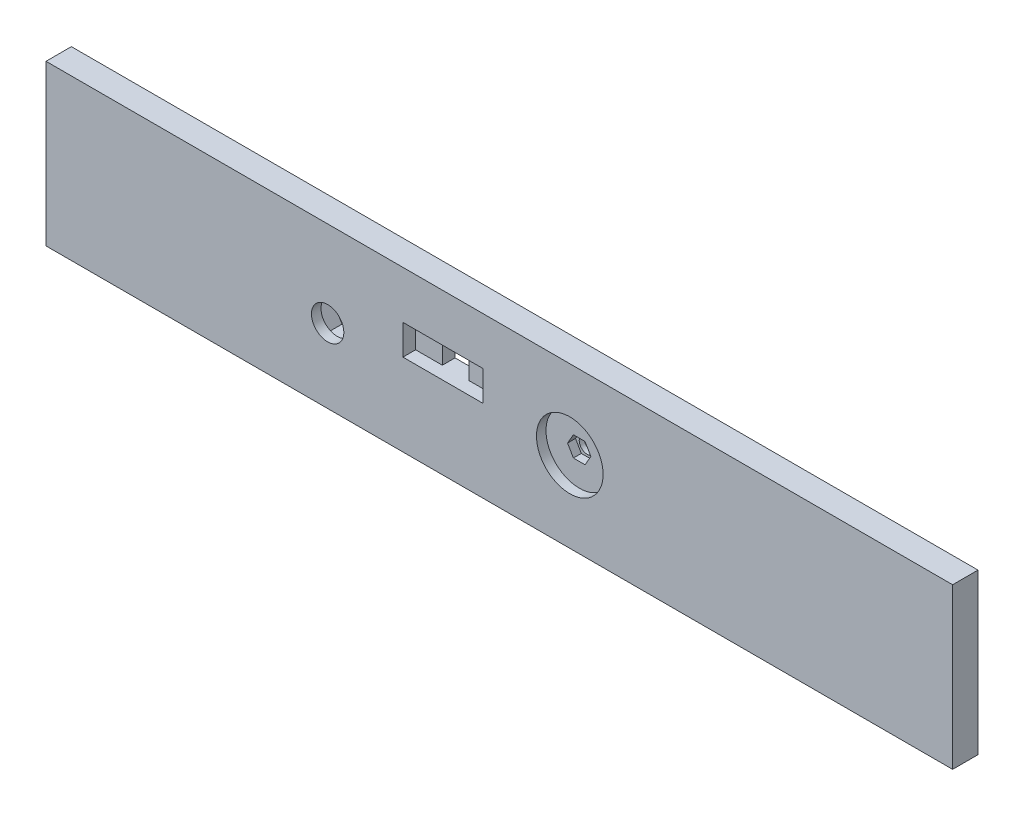
ISO-10303-21;
HEADER;
FILE_DESCRIPTION(('STEP AP214'),'2;1');
FILE_NAME('part.step','',(''),(''),'','','');
FILE_SCHEMA(('AUTOMOTIVE_DESIGN { 1 0 10303 214 1 1 1 1 }'));
ENDSEC;
DATA;
#1=APPLICATION_CONTEXT('core data for automotive mechanical design processes');
#2=APPLICATION_PROTOCOL_DEFINITION('international standard','automotive_design',2000,#1);
#3=PRODUCT_CONTEXT('',#1,'mechanical');
#4=PRODUCT('Part','Part','',(#3));
#5=PRODUCT_RELATED_PRODUCT_CATEGORY('part','',(#4));
#6=PRODUCT_DEFINITION_FORMATION('','',#4);
#7=PRODUCT_DEFINITION_CONTEXT('part definition',#1,'design');
#8=PRODUCT_DEFINITION('design','',#6,#7);
#9=PRODUCT_DEFINITION_SHAPE('','',#8);
#10=(LENGTH_UNIT() NAMED_UNIT(*) SI_UNIT(.MILLI.,.METRE.));
#11=(NAMED_UNIT(*) PLANE_ANGLE_UNIT() SI_UNIT($,.RADIAN.));
#12=(NAMED_UNIT(*) SI_UNIT($,.STERADIAN.) SOLID_ANGLE_UNIT());
#13=UNCERTAINTY_MEASURE_WITH_UNIT(LENGTH_MEASURE(1.E-05),#10,'distance_accuracy_value','');
#14=(GEOMETRIC_REPRESENTATION_CONTEXT(3) GLOBAL_UNCERTAINTY_ASSIGNED_CONTEXT((#13)) GLOBAL_UNIT_ASSIGNED_CONTEXT((#10,
#11,#12)) REPRESENTATION_CONTEXT('',''));
#15=CARTESIAN_POINT('',(0.,0.,0.));
#16=DIRECTION('',(0.,0.,1.));
#17=DIRECTION('',(1.,0.,0.));
#18=AXIS2_PLACEMENT_3D('',#15,#16,#17);
#19=CARTESIAN_POINT('',(258.55,70.8,8.));
#20=DIRECTION('',(1.,0.,0.));
#21=DIRECTION('',(0.,0.,-1.));
#22=AXIS2_PLACEMENT_3D('',#19,#20,#21);
#23=PLANE('',#22);
#24=DIRECTION('',(0.,-1.,0.));
#25=VECTOR('',#24,1.);
#26=CARTESIAN_POINT('',(258.55,70.8,0.));
#27=LINE('',#26,#25);
#28=CARTESIAN_POINT('',(258.55,70.8,0.));
#29=VERTEX_POINT('',#28);
#30=CARTESIAN_POINT('',(258.55,51.8,0.));
#31=VERTEX_POINT('',#30);
#32=EDGE_CURVE('E263',#29,#31,#27,.T.);
#33=ORIENTED_EDGE('',*,*,#32,.F.);
#34=DIRECTION('',(0.,0.,-1.));
#35=VECTOR('',#34,1.);
#36=CARTESIAN_POINT('',(258.55,70.8,8.));
#37=LINE('',#36,#35);
#38=CARTESIAN_POINT('',(258.55,70.8,-8.));
#39=VERTEX_POINT('',#38);
#40=EDGE_CURVE('E273',#29,#39,#37,.T.);
#41=ORIENTED_EDGE('',*,*,#40,.T.);
#42=DIRECTION('',(0.,-1.,0.));
#43=VECTOR('',#42,1.);
#44=CARTESIAN_POINT('',(258.55,0.,-8.));
#45=LINE('',#44,#43);
#46=CARTESIAN_POINT('',(258.55,51.8,-8.));
#47=VERTEX_POINT('',#46);
#48=EDGE_CURVE('E11',#39,#47,#45,.T.);
#49=ORIENTED_EDGE('',*,*,#48,.T.);
#50=DIRECTION('',(0.,0.,-1.));
#51=VECTOR('',#50,1.);
#52=CARTESIAN_POINT('',(258.55,51.8,8.));
#53=LINE('',#52,#51);
#54=EDGE_CURVE('E272',#31,#47,#53,.T.);
#55=ORIENTED_EDGE('',*,*,#54,.F.);
#56=EDGE_LOOP('',(#33,#41,#49,#55));
#57=FACE_BOUND('',#56,.T.);
#58=ADVANCED_FACE('F45',(#57),#23,.F.);
#59=CARTESIAN_POINT('',(241.85,70.8,8.));
#60=DIRECTION('',(-1.,0.,0.));
#61=DIRECTION('',(0.,0.,1.));
#62=AXIS2_PLACEMENT_3D('',#59,#60,#61);
#63=PLANE('',#62);
#64=DIRECTION('',(0.,1.,0.));
#65=VECTOR('',#64,1.);
#66=CARTESIAN_POINT('',(241.85,70.8,0.));
#67=LINE('',#66,#65);
#68=CARTESIAN_POINT('',(241.85,51.8,0.));
#69=VERTEX_POINT('',#68);
#70=CARTESIAN_POINT('',(241.85,70.8,0.));
#71=VERTEX_POINT('',#70);
#72=EDGE_CURVE('E253',#69,#71,#67,.T.);
#73=ORIENTED_EDGE('',*,*,#72,.F.);
#74=DIRECTION('',(0.,0.,-1.));
#75=VECTOR('',#74,1.);
#76=CARTESIAN_POINT('',(241.85,51.8,8.));
#77=LINE('',#76,#75);
#78=CARTESIAN_POINT('',(241.85,51.8,-8.));
#79=VERTEX_POINT('',#78);
#80=EDGE_CURVE('E223',#69,#79,#77,.T.);
#81=ORIENTED_EDGE('',*,*,#80,.T.);
#82=DIRECTION('',(0.,1.,0.));
#83=VECTOR('',#82,1.);
#84=CARTESIAN_POINT('',(241.85,0.,-8.));
#85=LINE('',#84,#83);
#86=CARTESIAN_POINT('',(241.85,70.8,-8.));
#87=VERTEX_POINT('',#86);
#88=EDGE_CURVE('E484',#79,#87,#85,.T.);
#89=ORIENTED_EDGE('',*,*,#88,.T.);
#90=DIRECTION('',(0.,0.,-1.));
#91=VECTOR('',#90,1.);
#92=CARTESIAN_POINT('',(241.85,70.8,8.));
#93=LINE('',#92,#91);
#94=EDGE_CURVE('E277',#71,#87,#93,.T.);
#95=ORIENTED_EDGE('',*,*,#94,.F.);
#96=EDGE_LOOP('',(#73,#81,#89,#95));
#97=FACE_BOUND('',#96,.T.);
#98=ADVANCED_FACE('F550',(#97),#63,.F.);
#99=CARTESIAN_POINT('',(177.536724471013,46.6000393211323,-8.));
#100=DIRECTION('',(0.,0.,1.));
#101=DIRECTION('',(1.,0.,0.));
#102=AXIS2_PLACEMENT_3D('',#99,#100,#101);
#103=CYLINDRICAL_SURFACE('',#102,10.2);
#104=CARTESIAN_POINT('',(177.536724471013,46.6000393211323,8.));
#105=DIRECTION('',(0.,0.,1.));
#106=DIRECTION('',(1.,0.,0.));
#107=AXIS2_PLACEMENT_3D('',#104,#105,#106);
#108=CIRCLE('',#107,10.2);
#109=CARTESIAN_POINT('',(187.736724471013,46.6000393211323,8.));
#110=VERTEX_POINT('',#109);
#111=EDGE_CURVE('E373',#110,#110,#108,.T.);
#112=ORIENTED_EDGE('',*,*,#111,.T.);
#113=EDGE_LOOP('',(#112));
#114=FACE_BOUND('',#113,.T.);
#115=CARTESIAN_POINT('',(177.536724471013,46.6000393211323,2.));
#116=DIRECTION('',(0.,0.,-1.));
#117=DIRECTION('',(-1.,0.,0.));
#118=AXIS2_PLACEMENT_3D('',#115,#116,#117);
#119=CIRCLE('',#118,10.2);
#120=CARTESIAN_POINT('',(167.336724471013,46.6000393211323,2.));
#121=VERTEX_POINT('',#120);
#122=EDGE_CURVE('E334',#121,#121,#119,.F.);
#123=ORIENTED_EDGE('',*,*,#122,.F.);
#124=EDGE_LOOP('',(#123));
#125=FACE_BOUND('',#124,.T.);
#126=ADVANCED_FACE('F556',(#114,#125),#103,.F.);
#127=CARTESIAN_POINT('',(333.795565484393,44.44,-3.));
#128=DIRECTION('',(0.866025403784437,-0.500000000000003,0.));
#129=DIRECTION('',(0.500000000000003,0.866025403784437,0.));
#130=AXIS2_PLACEMENT_3D('',#127,#128,#129);
#131=PLANE('',#130);
#132=DIRECTION('',(-0.500000000000003,-0.866025403784437,0.));
#133=VECTOR('',#132,1.);
#134=CARTESIAN_POINT('',(333.795565484393,44.44,2.));
#135=LINE('',#134,#133);
#136=CARTESIAN_POINT('',(337.467513196439,50.7999999999999,2.));
#137=VERTEX_POINT('',#136);
#138=CARTESIAN_POINT('',(333.795565484393,44.44,2.));
#139=VERTEX_POINT('',#138);
#140=EDGE_CURVE('E370',#137,#139,#135,.T.);
#141=ORIENTED_EDGE('',*,*,#140,.F.);
#142=DIRECTION('',(0.,0.,1.));
#143=VECTOR('',#142,1.);
#144=CARTESIAN_POINT('',(337.467513196439,50.7999999999999,-3.));
#145=LINE('',#144,#143);
#146=CARTESIAN_POINT('',(337.467513196439,50.7999999999999,-3.));
#147=VERTEX_POINT('',#146);
#148=EDGE_CURVE('E401',#147,#137,#145,.T.);
#149=ORIENTED_EDGE('',*,*,#148,.F.);
#150=DIRECTION('',(0.500000000000003,0.866025403784437,0.));
#151=VECTOR('',#150,1.);
#152=CARTESIAN_POINT('',(333.795565484393,44.44,-3.));
#153=LINE('',#152,#151);
#154=CARTESIAN_POINT('',(333.795565484393,44.44,-3.));
#155=VERTEX_POINT('',#154);
#156=EDGE_CURVE('E377',#155,#147,#153,.T.);
#157=ORIENTED_EDGE('',*,*,#156,.F.);
#158=DIRECTION('',(0.,0.,1.));
#159=VECTOR('',#158,1.);
#160=CARTESIAN_POINT('',(333.795565484393,44.44,-3.));
#161=LINE('',#160,#159);
#162=EDGE_CURVE('E402',#155,#139,#161,.T.);
#163=ORIENTED_EDGE('',*,*,#162,.T.);
#164=EDGE_LOOP('',(#141,#149,#157,#163));
#165=FACE_BOUND('',#164,.T.);
#166=ADVANCED_FACE('F598',(#165),#131,.F.);
#167=CARTESIAN_POINT('',(326.451670060301,44.44,-3.));
#168=DIRECTION('',(0.,-1.,0.));
#169=DIRECTION('',(0.,0.,-1.));
#170=AXIS2_PLACEMENT_3D('',#167,#168,#169);
#171=PLANE('',#170);
#172=DIRECTION('',(-1.,0.,0.));
#173=VECTOR('',#172,1.);
#174=CARTESIAN_POINT('',(326.451670060301,44.44,2.));
#175=LINE('',#174,#173);
#176=CARTESIAN_POINT('',(326.451670060301,44.44,2.));
#177=VERTEX_POINT('',#176);
#178=EDGE_CURVE('E367',#139,#177,#175,.T.);
#179=ORIENTED_EDGE('',*,*,#178,.F.);
#180=ORIENTED_EDGE('',*,*,#162,.F.);
#181=DIRECTION('',(1.,0.,0.));
#182=VECTOR('',#181,1.);
#183=CARTESIAN_POINT('',(326.451670060301,44.44,-3.));
#184=LINE('',#183,#182);
#185=CARTESIAN_POINT('',(326.451670060301,44.44,-3.));
#186=VERTEX_POINT('',#185);
#187=EDGE_CURVE('E397',#186,#155,#184,.T.);
#188=ORIENTED_EDGE('',*,*,#187,.F.);
#189=DIRECTION('',(0.,0.,1.));
#190=VECTOR('',#189,1.);
#191=CARTESIAN_POINT('',(326.451670060301,44.44,-3.));
#192=LINE('',#191,#190);
#193=EDGE_CURVE('E407',#186,#177,#192,.T.);
#194=ORIENTED_EDGE('',*,*,#193,.T.);
#195=EDGE_LOOP('',(#179,#180,#188,#194));
#196=FACE_BOUND('',#195,.T.);
#197=ADVANCED_FACE('F603',(#196),#171,.F.);
#198=CARTESIAN_POINT('',(322.779722348255,50.7999999999999,-3.));
#199=DIRECTION('',(-0.86602540378444,-0.499999999999998,0.));
#200=DIRECTION('',(0.499999999999998,-0.86602540378444,0.));
#201=AXIS2_PLACEMENT_3D('',#198,#199,#200);
#202=PLANE('',#201);
#203=DIRECTION('',(-0.499999999999998,0.86602540378444,0.));
#204=VECTOR('',#203,1.);
#205=CARTESIAN_POINT('',(322.779722348255,50.7999999999999,2.));
#206=LINE('',#205,#204);
#207=CARTESIAN_POINT('',(322.779722348255,50.7999999999999,2.));
#208=VERTEX_POINT('',#207);
#209=EDGE_CURVE('E364',#177,#208,#206,.T.);
#210=ORIENTED_EDGE('',*,*,#209,.F.);
#211=ORIENTED_EDGE('',*,*,#193,.F.);
#212=DIRECTION('',(0.499999999999998,-0.86602540378444,0.));
#213=VECTOR('',#212,1.);
#214=CARTESIAN_POINT('',(322.779722348255,50.7999999999999,-3.));
#215=LINE('',#214,#213);
#216=CARTESIAN_POINT('',(322.779722348255,50.7999999999999,-3.));
#217=VERTEX_POINT('',#216);
#218=EDGE_CURVE('E393',#217,#186,#215,.T.);
#219=ORIENTED_EDGE('',*,*,#218,.F.);
#220=DIRECTION('',(0.,0.,1.));
#221=VECTOR('',#220,1.);
#222=CARTESIAN_POINT('',(322.779722348255,50.7999999999999,-3.));
#223=LINE('',#222,#221);
#224=EDGE_CURVE('E411',#217,#208,#223,.T.);
#225=ORIENTED_EDGE('',*,*,#224,.T.);
#226=EDGE_LOOP('',(#210,#211,#219,#225));
#227=FACE_BOUND('',#226,.T.);
#228=ADVANCED_FACE('F606',(#227),#202,.F.);
#229=CARTESIAN_POINT('',(326.451670060301,57.1599999999999,-3.));
#230=DIRECTION('',(-0.866025403784441,0.499999999999996,0.));
#231=DIRECTION('',(-0.499999999999996,-0.866025403784441,0.));
#232=AXIS2_PLACEMENT_3D('',#229,#230,#231);
#233=PLANE('',#232);
#234=DIRECTION('',(0.499999999999996,0.866025403784441,0.));
#235=VECTOR('',#234,1.);
#236=CARTESIAN_POINT('',(326.451670060301,57.1599999999999,2.));
#237=LINE('',#236,#235);
#238=CARTESIAN_POINT('',(326.451670060301,57.1599999999999,2.));
#239=VERTEX_POINT('',#238);
#240=EDGE_CURVE('E361',#208,#239,#237,.T.);
#241=ORIENTED_EDGE('',*,*,#240,.F.);
#242=ORIENTED_EDGE('',*,*,#224,.F.);
#243=DIRECTION('',(-0.499999999999996,-0.866025403784441,0.));
#244=VECTOR('',#243,1.);
#245=CARTESIAN_POINT('',(326.451670060301,57.1599999999999,-3.));
#246=LINE('',#245,#244);
#247=CARTESIAN_POINT('',(326.451670060301,57.1599999999999,-3.));
#248=VERTEX_POINT('',#247);
#249=EDGE_CURVE('E389',#248,#217,#246,.T.);
#250=ORIENTED_EDGE('',*,*,#249,.F.);
#251=DIRECTION('',(0.,0.,1.));
#252=VECTOR('',#251,1.);
#253=CARTESIAN_POINT('',(326.451670060301,57.1599999999999,-3.));
#254=LINE('',#253,#252);
#255=EDGE_CURVE('E415',#248,#239,#254,.T.);
#256=ORIENTED_EDGE('',*,*,#255,.T.);
#257=EDGE_LOOP('',(#241,#242,#250,#256));
#258=FACE_BOUND('',#257,.T.);
#259=ADVANCED_FACE('F610',(#258),#233,.F.);
#260=CARTESIAN_POINT('',(333.795565484393,57.1599999999999,-3.));
#261=DIRECTION('',(0.,1.,0.));
#262=DIRECTION('',(0.,0.,1.));
#263=AXIS2_PLACEMENT_3D('',#260,#261,#262);
#264=PLANE('',#263);
#265=DIRECTION('',(1.,0.,0.));
#266=VECTOR('',#265,1.);
#267=CARTESIAN_POINT('',(333.795565484393,57.1599999999999,2.));
#268=LINE('',#267,#266);
#269=CARTESIAN_POINT('',(333.795565484393,57.1599999999999,2.));
#270=VERTEX_POINT('',#269);
#271=EDGE_CURVE('E354',#239,#270,#268,.T.);
#272=ORIENTED_EDGE('',*,*,#271,.F.);
#273=ORIENTED_EDGE('',*,*,#255,.F.);
#274=DIRECTION('',(-1.,0.,0.));
#275=VECTOR('',#274,1.);
#276=CARTESIAN_POINT('',(333.795565484393,57.1599999999999,-3.));
#277=LINE('',#276,#275);
#278=CARTESIAN_POINT('',(333.795565484393,57.1599999999999,-3.));
#279=VERTEX_POINT('',#278);
#280=EDGE_CURVE('E385',#279,#248,#277,.T.);
#281=ORIENTED_EDGE('',*,*,#280,.F.);
#282=DIRECTION('',(0.,0.,1.));
#283=VECTOR('',#282,1.);
#284=CARTESIAN_POINT('',(333.795565484393,57.1599999999999,-3.));
#285=LINE('',#284,#283);
#286=EDGE_CURVE('E419',#279,#270,#285,.T.);
#287=ORIENTED_EDGE('',*,*,#286,.T.);
#288=EDGE_LOOP('',(#272,#273,#281,#287));
#289=FACE_BOUND('',#288,.T.);
#290=ADVANCED_FACE('F614',(#289),#264,.F.);
#291=CARTESIAN_POINT('',(337.467513196439,50.7999999999999,-3.));
#292=DIRECTION('',(0.866025403784438,0.500000000000002,0.));
#293=DIRECTION('',(-0.500000000000002,0.866025403784438,0.));
#294=AXIS2_PLACEMENT_3D('',#291,#292,#293);
#295=PLANE('',#294);
#296=DIRECTION('',(0.500000000000002,-0.866025403784438,0.));
#297=VECTOR('',#296,1.);
#298=CARTESIAN_POINT('',(337.467513196439,50.7999999999999,2.));
#299=LINE('',#298,#297);
#300=EDGE_CURVE('E472',#270,#137,#299,.T.);
#301=ORIENTED_EDGE('',*,*,#300,.F.);
#302=ORIENTED_EDGE('',*,*,#286,.F.);
#303=DIRECTION('',(-0.500000000000002,0.866025403784437,0.));
#304=VECTOR('',#303,1.);
#305=CARTESIAN_POINT('',(337.467513196439,50.7999999999999,-3.));
#306=LINE('',#305,#304);
#307=EDGE_CURVE('E381',#147,#279,#306,.T.);
#308=ORIENTED_EDGE('',*,*,#307,.F.);
#309=ORIENTED_EDGE('',*,*,#148,.T.);
#310=EDGE_LOOP('',(#301,#302,#308,#309));
#311=FACE_BOUND('',#310,.T.);
#312=ADVANCED_FACE('F618',(#311),#295,.F.);
#313=CARTESIAN_POINT('',(330.123617772347,50.8,8.));
#314=DIRECTION('',(0.,0.,-1.));
#315=DIRECTION('',(-1.,0.,0.));
#316=AXIS2_PLACEMENT_3D('',#313,#314,#315);
#317=CYLINDRICAL_SURFACE('',#316,4.99999999999999);
#318=CARTESIAN_POINT('',(330.123617772347,50.8,-6.));
#319=DIRECTION('',(0.,0.,-1.));
#320=DIRECTION('',(-1.,0.,0.));
#321=AXIS2_PLACEMENT_3D('',#318,#319,#320);
#322=CIRCLE('',#321,4.99999999999999);
#323=CARTESIAN_POINT('',(325.123617772347,50.8,-6.));
#324=VERTEX_POINT('',#323);
#325=EDGE_CURVE('E426',#324,#324,#322,.T.);
#326=ORIENTED_EDGE('',*,*,#325,.T.);
#327=EDGE_LOOP('',(#326));
#328=FACE_BOUND('',#327,.T.);
#329=CARTESIAN_POINT('',(330.123617772347,50.8,-3.));
#330=DIRECTION('',(0.,0.,1.));
#331=DIRECTION('',(1.,0.,0.));
#332=AXIS2_PLACEMENT_3D('',#329,#330,#331);
#333=CIRCLE('',#332,4.99999999999999);
#334=CARTESIAN_POINT('',(335.123617772347,50.8,-3.));
#335=VERTEX_POINT('',#334);
#336=EDGE_CURVE('E406',#335,#335,#333,.F.);
#337=ORIENTED_EDGE('',*,*,#336,.F.);
#338=EDGE_LOOP('',(#337));
#339=FACE_BOUND('',#338,.T.);
#340=ADVANCED_FACE('F622',(#328,#339),#317,.F.);
#341=CARTESIAN_POINT('',(0.,0.,8.));
#342=DIRECTION('',(1.,0.,0.));
#343=DIRECTION('',(0.,0.,-1.));
#344=AXIS2_PLACEMENT_3D('',#341,#342,#343);
#345=PLANE('',#344);
#346=DIRECTION('',(0.,-1.,0.));
#347=VECTOR('',#346,1.);
#348=CARTESIAN_POINT('',(0.,0.,-8.));
#349=LINE('',#348,#347);
#350=CARTESIAN_POINT('',(0.,100.8,-8.));
#351=VERTEX_POINT('',#350);
#352=CARTESIAN_POINT('',(0.,0.,-8.));
#353=VERTEX_POINT('',#352);
#354=EDGE_CURVE('E430',#351,#353,#349,.T.);
#355=ORIENTED_EDGE('',*,*,#354,.T.);
#356=DIRECTION('',(0.,0.,-1.));
#357=VECTOR('',#356,1.);
#358=CARTESIAN_POINT('',(0.,0.,8.));
#359=LINE('',#358,#357);
#360=CARTESIAN_POINT('',(0.,0.,8.));
#361=VERTEX_POINT('',#360);
#362=EDGE_CURVE('E468',#361,#353,#359,.T.);
#363=ORIENTED_EDGE('',*,*,#362,.F.);
#364=DIRECTION('',(0.,-1.,0.));
#365=VECTOR('',#364,1.);
#366=CARTESIAN_POINT('',(0.,0.,8.));
#367=LINE('',#366,#365);
#368=CARTESIAN_POINT('',(0.,100.8,8.));
#369=VERTEX_POINT('',#368);
#370=EDGE_CURVE('E431',#369,#361,#367,.T.);
#371=ORIENTED_EDGE('',*,*,#370,.F.);
#372=DIRECTION('',(0.,0.,-1.));
#373=VECTOR('',#372,1.);
#374=CARTESIAN_POINT('',(0.,100.8,8.));
#375=LINE('',#374,#373);
#376=EDGE_CURVE('E445',#369,#351,#375,.T.);
#377=ORIENTED_EDGE('',*,*,#376,.T.);
#378=EDGE_LOOP('',(#355,#363,#371,#377));
#379=FACE_BOUND('',#378,.T.);
#380=ADVANCED_FACE('F47',(#379),#345,.F.);
#381=CARTESIAN_POINT('',(0.,0.,8.));
#382=DIRECTION('',(0.,1.,0.));
#383=DIRECTION('',(0.,0.,1.));
#384=AXIS2_PLACEMENT_3D('',#381,#382,#383);
#385=PLANE('',#384);
#386=DIRECTION('',(1.,0.,0.));
#387=VECTOR('',#386,1.);
#388=CARTESIAN_POINT('',(0.,0.,-8.));
#389=LINE('',#388,#387);
#390=CARTESIAN_POINT('',(571.5,0.,-8.));
#391=VERTEX_POINT('',#390);
#392=EDGE_CURVE('E449',#353,#391,#389,.T.);
#393=ORIENTED_EDGE('',*,*,#392,.T.);
#394=DIRECTION('',(0.,0.,-1.));
#395=VECTOR('',#394,1.);
#396=CARTESIAN_POINT('',(571.5,0.,8.));
#397=LINE('',#396,#395);
#398=CARTESIAN_POINT('',(571.5,0.,8.));
#399=VERTEX_POINT('',#398);
#400=EDGE_CURVE('E464',#399,#391,#397,.T.);
#401=ORIENTED_EDGE('',*,*,#400,.F.);
#402=DIRECTION('',(1.,0.,0.));
#403=VECTOR('',#402,1.);
#404=CARTESIAN_POINT('',(0.,0.,8.));
#405=LINE('',#404,#403);
#406=EDGE_CURVE('E435',#361,#399,#405,.T.);
#407=ORIENTED_EDGE('',*,*,#406,.F.);
#408=ORIENTED_EDGE('',*,*,#362,.T.);
#409=EDGE_LOOP('',(#393,#401,#407,#408));
#410=FACE_BOUND('',#409,.T.);
#411=ADVANCED_FACE('F527',(#410),#385,.F.);
#412=CARTESIAN_POINT('',(571.5,0.,8.));
#413=DIRECTION('',(-1.,0.,0.));
#414=DIRECTION('',(0.,0.,1.));
#415=AXIS2_PLACEMENT_3D('',#412,#413,#414);
#416=PLANE('',#415);
#417=DIRECTION('',(0.,1.,0.));
#418=VECTOR('',#417,1.);
#419=CARTESIAN_POINT('',(571.5,0.,-8.));
#420=LINE('',#419,#418);
#421=CARTESIAN_POINT('',(571.5,100.8,-8.));
#422=VERTEX_POINT('',#421);
#423=EDGE_CURVE('E452',#391,#422,#420,.T.);
#424=ORIENTED_EDGE('',*,*,#423,.T.);
#425=DIRECTION('',(0.,0.,-1.));
#426=VECTOR('',#425,1.);
#427=CARTESIAN_POINT('',(571.5,100.8,8.));
#428=LINE('',#427,#426);
#429=CARTESIAN_POINT('',(571.5,100.8,8.));
#430=VERTEX_POINT('',#429);
#431=EDGE_CURVE('E460',#430,#422,#428,.T.);
#432=ORIENTED_EDGE('',*,*,#431,.F.);
#433=DIRECTION('',(0.,1.,0.));
#434=VECTOR('',#433,1.);
#435=CARTESIAN_POINT('',(571.5,0.,8.));
#436=LINE('',#435,#434);
#437=EDGE_CURVE('E439',#399,#430,#436,.T.);
#438=ORIENTED_EDGE('',*,*,#437,.F.);
#439=ORIENTED_EDGE('',*,*,#400,.T.);
#440=EDGE_LOOP('',(#424,#432,#438,#439));
#441=FACE_BOUND('',#440,.T.);
#442=ADVANCED_FACE('F532',(#441),#416,.F.);
#443=CARTESIAN_POINT('',(0.,100.8,8.));
#444=DIRECTION('',(0.,-1.,0.));
#445=DIRECTION('',(0.,0.,-1.));
#446=AXIS2_PLACEMENT_3D('',#443,#444,#445);
#447=PLANE('',#446);
#448=DIRECTION('',(-1.,0.,0.));
#449=VECTOR('',#448,1.);
#450=CARTESIAN_POINT('',(0.,100.8,-8.));
#451=LINE('',#450,#449);
#452=EDGE_CURVE('E436',#422,#351,#451,.T.);
#453=ORIENTED_EDGE('',*,*,#452,.T.);
#454=ORIENTED_EDGE('',*,*,#376,.F.);
#455=DIRECTION('',(-1.,0.,0.));
#456=VECTOR('',#455,1.);
#457=CARTESIAN_POINT('',(0.,100.8,8.));
#458=LINE('',#457,#456);
#459=EDGE_CURVE('E442',#430,#369,#458,.T.);
#460=ORIENTED_EDGE('',*,*,#459,.F.);
#461=ORIENTED_EDGE('',*,*,#431,.T.);
#462=EDGE_LOOP('',(#453,#454,#460,#461));
#463=FACE_BOUND('',#462,.T.);
#464=ADVANCED_FACE('F513',(#463),#447,.F.);
#465=CARTESIAN_POINT('',(0.,0.,8.));
#466=DIRECTION('',(0.,0.,-1.));
#467=DIRECTION('',(-1.,0.,0.));
#468=AXIS2_PLACEMENT_3D('',#465,#466,#467);
#469=PLANE('',#468);
#470=DIRECTION('',(1.,0.,0.));
#471=VECTOR('',#470,1.);
#472=CARTESIAN_POINT('',(258.55,70.8,8.));
#473=LINE('',#472,#471);
#474=CARTESIAN_POINT('',(225.,70.8,8.));
#475=VERTEX_POINT('',#474);
#476=CARTESIAN_POINT('',(275.4,70.8,8.));
#477=VERTEX_POINT('',#476);
#478=EDGE_CURVE('E269',#475,#477,#473,.T.);
#479=ORIENTED_EDGE('',*,*,#478,.T.);
#480=DIRECTION('',(0.,1.,0.));
#481=VECTOR('',#480,1.);
#482=CARTESIAN_POINT('',(275.4,70.8,8.));
#483=LINE('',#482,#481);
#484=CARTESIAN_POINT('',(275.4,51.8,8.));
#485=VERTEX_POINT('',#484);
#486=EDGE_CURVE('E233',#485,#477,#483,.T.);
#487=ORIENTED_EDGE('',*,*,#486,.F.);
#488=DIRECTION('',(-1.,0.,0.));
#489=VECTOR('',#488,1.);
#490=CARTESIAN_POINT('',(258.55,51.8,8.));
#491=LINE('',#490,#489);
#492=CARTESIAN_POINT('',(225.,51.8,8.));
#493=VERTEX_POINT('',#492);
#494=EDGE_CURVE('E266',#485,#493,#491,.T.);
#495=ORIENTED_EDGE('',*,*,#494,.T.);
#496=DIRECTION('',(0.,-1.,0.));
#497=VECTOR('',#496,1.);
#498=CARTESIAN_POINT('',(225.,70.8,8.));
#499=LINE('',#498,#497);
#500=EDGE_CURVE('E215',#475,#493,#499,.T.);
#501=ORIENTED_EDGE('',*,*,#500,.F.);
#502=EDGE_LOOP('',(#479,#487,#495,#501));
#503=FACE_BOUND('',#502,.T.);
#504=CARTESIAN_POINT('',(330.163945869874,50.8218449205319,8.));
#505=DIRECTION('',(0.,0.,1.));
#506=DIRECTION('',(1.,0.,0.));
#507=AXIS2_PLACEMENT_3D('',#504,#505,#506);
#508=CIRCLE('',#507,21.);
#509=CARTESIAN_POINT('',(351.163945869874,50.8218449205319,8.));
#510=VERTEX_POINT('',#509);
#511=EDGE_CURVE('E355',#510,#510,#508,.T.);
#512=ORIENTED_EDGE('',*,*,#511,.F.);
#513=EDGE_LOOP('',(#512));
#514=FACE_BOUND('',#513,.T.);
#515=ORIENTED_EDGE('',*,*,#111,.F.);
#516=EDGE_LOOP('',(#515));
#517=FACE_BOUND('',#516,.T.);
#518=ORIENTED_EDGE('',*,*,#370,.T.);
#519=ORIENTED_EDGE('',*,*,#406,.T.);
#520=ORIENTED_EDGE('',*,*,#437,.T.);
#521=ORIENTED_EDGE('',*,*,#459,.T.);
#522=EDGE_LOOP('',(#518,#519,#520,#521));
#523=FACE_BOUND('',#522,.T.);
#524=ADVANCED_FACE('F510',(#503,#514,#517,#523),#469,.F.);
#525=CARTESIAN_POINT('',(0.,0.,-8.));
#526=DIRECTION('',(0.,0.,-1.));
#527=DIRECTION('',(-1.,0.,0.));
#528=AXIS2_PLACEMENT_3D('',#525,#526,#527);
#529=PLANE('',#528);
#530=CARTESIAN_POINT('',(330.163945869874,50.8218449205319,-8.));
#531=DIRECTION('',(0.,0.,-1.));
#532=DIRECTION('',(-1.,0.,0.));
#533=AXIS2_PLACEMENT_3D('',#530,#531,#532);
#534=CIRCLE('',#533,15.);
#535=CARTESIAN_POINT('',(315.163945869874,50.8218449205319,-8.));
#536=VERTEX_POINT('',#535);
#537=EDGE_CURVE('E240',#536,#536,#534,.T.);
#538=ORIENTED_EDGE('',*,*,#537,.F.);
#539=EDGE_LOOP('',(#538));
#540=FACE_BOUND('',#539,.T.);
#541=ORIENTED_EDGE('',*,*,#48,.F.);
#542=DIRECTION('',(1.,0.,0.));
#543=VECTOR('',#542,1.);
#544=CARTESIAN_POINT('',(0.,70.8,-8.));
#545=LINE('',#544,#543);
#546=EDGE_CURVE('E54',#87,#39,#545,.T.);
#547=ORIENTED_EDGE('',*,*,#546,.F.);
#548=ORIENTED_EDGE('',*,*,#88,.F.);
#549=DIRECTION('',(-1.,0.,0.));
#550=VECTOR('',#549,1.);
#551=CARTESIAN_POINT('',(0.,51.8,-8.));
#552=LINE('',#551,#550);
#553=EDGE_CURVE('E478',#47,#79,#552,.T.);
#554=ORIENTED_EDGE('',*,*,#553,.F.);
#555=EDGE_LOOP('',(#541,#547,#548,#554));
#556=FACE_BOUND('',#555,.T.);
#557=DIRECTION('',(-0.500000000000001,0.866025403784438,0.));
#558=VECTOR('',#557,1.);
#559=CARTESIAN_POINT('',(170.608521240738,34.6000393211323,-8.));
#560=LINE('',#559,#558);
#561=CARTESIAN_POINT('',(170.608521240738,34.6000393211323,-8.));
#562=VERTEX_POINT('',#561);
#563=CARTESIAN_POINT('',(163.680318010462,46.6000393211323,-8.));
#564=VERTEX_POINT('',#563);
#565=EDGE_CURVE('E276',#562,#564,#560,.T.);
#566=ORIENTED_EDGE('',*,*,#565,.F.);
#567=DIRECTION('',(-1.,0.,0.));
#568=VECTOR('',#567,1.);
#569=CARTESIAN_POINT('',(184.464927701289,34.6000393211323,-8.));
#570=LINE('',#569,#568);
#571=CARTESIAN_POINT('',(184.464927701289,34.6000393211323,-8.));
#572=VERTEX_POINT('',#571);
#573=EDGE_CURVE('E289',#572,#562,#570,.T.);
#574=ORIENTED_EDGE('',*,*,#573,.F.);
#575=DIRECTION('',(-0.499999999999999,-0.866025403784439,0.));
#576=VECTOR('',#575,1.);
#577=CARTESIAN_POINT('',(191.393130931564,46.6000393211323,-8.));
#578=LINE('',#577,#576);
#579=CARTESIAN_POINT('',(191.393130931564,46.6000393211323,-8.));
#580=VERTEX_POINT('',#579);
#581=EDGE_CURVE('E324',#580,#572,#578,.T.);
#582=ORIENTED_EDGE('',*,*,#581,.F.);
#583=DIRECTION('',(0.499999999999999,-0.866025403784439,0.));
#584=VECTOR('',#583,1.);
#585=CARTESIAN_POINT('',(184.464927701289,58.6000393211324,-8.));
#586=LINE('',#585,#584);
#587=CARTESIAN_POINT('',(184.464927701289,58.6000393211324,-8.));
#588=VERTEX_POINT('',#587);
#589=EDGE_CURVE('E320',#588,#580,#586,.T.);
#590=ORIENTED_EDGE('',*,*,#589,.F.);
#591=DIRECTION('',(1.,0.,0.));
#592=VECTOR('',#591,1.);
#593=CARTESIAN_POINT('',(170.608521240738,58.6000393211324,-8.));
#594=LINE('',#593,#592);
#595=CARTESIAN_POINT('',(170.608521240738,58.6000393211324,-8.));
#596=VERTEX_POINT('',#595);
#597=EDGE_CURVE('E316',#596,#588,#594,.T.);
#598=ORIENTED_EDGE('',*,*,#597,.F.);
#599=DIRECTION('',(0.500000000000001,0.866025403784438,0.));
#600=VECTOR('',#599,1.);
#601=CARTESIAN_POINT('',(163.680318010462,46.6000393211323,-8.));
#602=LINE('',#601,#600);
#603=EDGE_CURVE('E312',#564,#596,#602,.T.);
#604=ORIENTED_EDGE('',*,*,#603,.F.);
#605=EDGE_LOOP('',(#566,#574,#582,#590,#598,#604));
#606=FACE_BOUND('',#605,.T.);
#607=ORIENTED_EDGE('',*,*,#354,.F.);
#608=ORIENTED_EDGE('',*,*,#452,.F.);
#609=ORIENTED_EDGE('',*,*,#423,.F.);
#610=ORIENTED_EDGE('',*,*,#392,.F.);
#611=EDGE_LOOP('',(#607,#608,#609,#610));
#612=FACE_BOUND('',#611,.T.);
#613=ADVANCED_FACE('F498',(#540,#556,#606,#612),#529,.T.);
#614=CARTESIAN_POINT('',(330.123617772347,50.8,-6.));
#615=DIRECTION('',(0.,0.,-1.));
#616=DIRECTION('',(-1.,0.,0.));
#617=AXIS2_PLACEMENT_3D('',#614,#615,#616);
#618=PLANE('',#617);
#619=ORIENTED_EDGE('',*,*,#325,.F.);
#620=EDGE_LOOP('',(#619));
#621=FACE_BOUND('',#620,.T.);
#622=CARTESIAN_POINT('',(330.163945869874,50.8218449205319,-6.));
#623=DIRECTION('',(0.,0.,-1.));
#624=DIRECTION('',(-1.,0.,0.));
#625=AXIS2_PLACEMENT_3D('',#622,#623,#624);
#626=CIRCLE('',#625,15.);
#627=CARTESIAN_POINT('',(315.163945869874,50.8218449205319,-6.));
#628=VERTEX_POINT('',#627);
#629=EDGE_CURVE('E248',#628,#628,#626,.T.);
#630=ORIENTED_EDGE('',*,*,#629,.T.);
#631=EDGE_LOOP('',(#630));
#632=FACE_BOUND('',#631,.T.);
#633=ADVANCED_FACE('F537',(#621,#632),#618,.T.);
#634=CARTESIAN_POINT('',(0.,0.,-3.));
#635=DIRECTION('',(0.,0.,1.));
#636=DIRECTION('',(1.,0.,0.));
#637=AXIS2_PLACEMENT_3D('',#634,#635,#636);
#638=PLANE('',#637);
#639=ORIENTED_EDGE('',*,*,#156,.T.);
#640=ORIENTED_EDGE('',*,*,#307,.T.);
#641=ORIENTED_EDGE('',*,*,#280,.T.);
#642=ORIENTED_EDGE('',*,*,#249,.T.);
#643=ORIENTED_EDGE('',*,*,#218,.T.);
#644=ORIENTED_EDGE('',*,*,#187,.T.);
#645=EDGE_LOOP('',(#639,#640,#641,#642,#643,#644));
#646=FACE_BOUND('',#645,.T.);
#647=ORIENTED_EDGE('',*,*,#336,.T.);
#648=EDGE_LOOP('',(#647));
#649=FACE_BOUND('',#648,.T.);
#650=ADVANCED_FACE('F544',(#646,#649),#638,.T.);
#651=CARTESIAN_POINT('',(330.163945869874,50.8218449205319,2.));
#652=DIRECTION('',(0.,0.,1.));
#653=DIRECTION('',(1.,0.,0.));
#654=AXIS2_PLACEMENT_3D('',#651,#652,#653);
#655=PLANE('',#654);
#656=CARTESIAN_POINT('',(330.163945869874,50.8218449205319,2.));
#657=DIRECTION('',(0.,0.,1.));
#658=DIRECTION('',(1.,0.,0.));
#659=AXIS2_PLACEMENT_3D('',#656,#657,#658);
#660=CIRCLE('',#659,21.);
#661=CARTESIAN_POINT('',(351.163945869874,50.8218449205319,2.));
#662=VERTEX_POINT('',#661);
#663=EDGE_CURVE('E350',#662,#662,#660,.T.);
#664=ORIENTED_EDGE('',*,*,#663,.T.);
#665=EDGE_LOOP('',(#664));
#666=FACE_BOUND('',#665,.T.);
#667=ORIENTED_EDGE('',*,*,#140,.T.);
#668=ORIENTED_EDGE('',*,*,#178,.T.);
#669=ORIENTED_EDGE('',*,*,#209,.T.);
#670=ORIENTED_EDGE('',*,*,#240,.T.);
#671=ORIENTED_EDGE('',*,*,#271,.T.);
#672=ORIENTED_EDGE('',*,*,#300,.T.);
#673=EDGE_LOOP('',(#667,#668,#669,#670,#671,#672));
#674=FACE_BOUND('',#673,.T.);
#675=ADVANCED_FACE('F589',(#666,#674),#655,.T.);
#676=CARTESIAN_POINT('',(330.163945869874,50.8218449205319,2.));
#677=DIRECTION('',(0.,0.,1.));
#678=DIRECTION('',(1.,0.,0.));
#679=AXIS2_PLACEMENT_3D('',#676,#677,#678);
#680=CYLINDRICAL_SURFACE('',#679,21.);
#681=ORIENTED_EDGE('',*,*,#663,.F.);
#682=EDGE_LOOP('',(#681));
#683=FACE_BOUND('',#682,.T.);
#684=ORIENTED_EDGE('',*,*,#511,.T.);
#685=EDGE_LOOP('',(#684));
#686=FACE_BOUND('',#685,.T.);
#687=ADVANCED_FACE('F565',(#683,#686),#680,.F.);
#688=CARTESIAN_POINT('',(0.,0.,2.));
#689=DIRECTION('',(0.,0.,-1.));
#690=DIRECTION('',(-1.,0.,0.));
#691=AXIS2_PLACEMENT_3D('',#688,#689,#690);
#692=PLANE('',#691);
#693=DIRECTION('',(-0.500000000000001,0.866025403784438,0.));
#694=VECTOR('',#693,1.);
#695=CARTESIAN_POINT('',(170.608521240738,34.6000393211323,2.));
#696=LINE('',#695,#694);
#697=CARTESIAN_POINT('',(170.608521240738,34.6000393211323,2.));
#698=VERTEX_POINT('',#697);
#699=CARTESIAN_POINT('',(163.680318010462,46.6000393211323,2.));
#700=VERTEX_POINT('',#699);
#701=EDGE_CURVE('E284',#698,#700,#696,.T.);
#702=ORIENTED_EDGE('',*,*,#701,.T.);
#703=DIRECTION('',(0.500000000000001,0.866025403784438,0.));
#704=VECTOR('',#703,1.);
#705=CARTESIAN_POINT('',(163.680318010462,46.6000393211323,2.));
#706=LINE('',#705,#704);
#707=CARTESIAN_POINT('',(170.608521240738,58.6000393211324,2.));
#708=VERTEX_POINT('',#707);
#709=EDGE_CURVE('E288',#700,#708,#706,.T.);
#710=ORIENTED_EDGE('',*,*,#709,.T.);
#711=DIRECTION('',(1.,0.,0.));
#712=VECTOR('',#711,1.);
#713=CARTESIAN_POINT('',(170.608521240738,58.6000393211324,2.));
#714=LINE('',#713,#712);
#715=CARTESIAN_POINT('',(184.464927701289,58.6000393211324,2.));
#716=VERTEX_POINT('',#715);
#717=EDGE_CURVE('E293',#708,#716,#714,.T.);
#718=ORIENTED_EDGE('',*,*,#717,.T.);
#719=DIRECTION('',(0.499999999999999,-0.866025403784439,0.));
#720=VECTOR('',#719,1.);
#721=CARTESIAN_POINT('',(184.464927701289,58.6000393211324,2.));
#722=LINE('',#721,#720);
#723=CARTESIAN_POINT('',(191.393130931564,46.6000393211323,2.));
#724=VERTEX_POINT('',#723);
#725=EDGE_CURVE('E297',#716,#724,#722,.T.);
#726=ORIENTED_EDGE('',*,*,#725,.T.);
#727=DIRECTION('',(-0.499999999999999,-0.866025403784439,0.));
#728=VECTOR('',#727,1.);
#729=CARTESIAN_POINT('',(191.393130931564,46.6000393211323,2.));
#730=LINE('',#729,#728);
#731=CARTESIAN_POINT('',(184.464927701289,34.6000393211323,2.));
#732=VERTEX_POINT('',#731);
#733=EDGE_CURVE('E301',#724,#732,#730,.T.);
#734=ORIENTED_EDGE('',*,*,#733,.T.);
#735=DIRECTION('',(-1.,0.,0.));
#736=VECTOR('',#735,1.);
#737=CARTESIAN_POINT('',(184.464927701289,34.6000393211323,2.));
#738=LINE('',#737,#736);
#739=EDGE_CURVE('E305',#732,#698,#738,.T.);
#740=ORIENTED_EDGE('',*,*,#739,.T.);
#741=EDGE_LOOP('',(#702,#710,#718,#726,#734,#740));
#742=FACE_BOUND('',#741,.T.);
#743=ORIENTED_EDGE('',*,*,#122,.T.);
#744=EDGE_LOOP('',(#743));
#745=FACE_BOUND('',#744,.T.);
#746=ADVANCED_FACE('F561',(#742,#745),#692,.T.);
#747=CARTESIAN_POINT('',(170.608521240738,34.6000393211323,2.));
#748=DIRECTION('',(-0.866025403784438,-0.500000000000001,0.));
#749=DIRECTION('',(0.500000000000001,-0.866025403784438,0.));
#750=AXIS2_PLACEMENT_3D('',#747,#748,#749);
#751=PLANE('',#750);
#752=ORIENTED_EDGE('',*,*,#565,.T.);
#753=DIRECTION('',(0.,0.,-1.));
#754=VECTOR('',#753,1.);
#755=CARTESIAN_POINT('',(163.680318010462,46.6000393211323,2.));
#756=LINE('',#755,#754);
#757=EDGE_CURVE('E309',#700,#564,#756,.T.);
#758=ORIENTED_EDGE('',*,*,#757,.F.);
#759=ORIENTED_EDGE('',*,*,#701,.F.);
#760=DIRECTION('',(0.,0.,-1.));
#761=VECTOR('',#760,1.);
#762=CARTESIAN_POINT('',(170.608521240738,34.6000393211323,2.));
#763=LINE('',#762,#761);
#764=EDGE_CURVE('E331',#698,#562,#763,.T.);
#765=ORIENTED_EDGE('',*,*,#764,.T.);
#766=EDGE_LOOP('',(#752,#758,#759,#765));
#767=FACE_BOUND('',#766,.T.);
#768=ADVANCED_FACE('F564',(#767),#751,.F.);
#769=CARTESIAN_POINT('',(184.464927701289,34.6000393211323,2.));
#770=DIRECTION('',(0.,-1.,0.));
#771=DIRECTION('',(0.,0.,-1.));
#772=AXIS2_PLACEMENT_3D('',#769,#770,#771);
#773=PLANE('',#772);
#774=ORIENTED_EDGE('',*,*,#573,.T.);
#775=ORIENTED_EDGE('',*,*,#764,.F.);
#776=ORIENTED_EDGE('',*,*,#739,.F.);
#777=DIRECTION('',(0.,0.,-1.));
#778=VECTOR('',#777,1.);
#779=CARTESIAN_POINT('',(184.464927701289,34.6000393211323,2.));
#780=LINE('',#779,#778);
#781=EDGE_CURVE('E335',#732,#572,#780,.T.);
#782=ORIENTED_EDGE('',*,*,#781,.T.);
#783=EDGE_LOOP('',(#774,#775,#776,#782));
#784=FACE_BOUND('',#783,.T.);
#785=ADVANCED_FACE('F567',(#784),#773,.F.);
#786=CARTESIAN_POINT('',(191.393130931564,46.6000393211323,2.));
#787=DIRECTION('',(0.866025403784439,-0.5,0.));
#788=DIRECTION('',(0.5,0.866025403784439,0.));
#789=AXIS2_PLACEMENT_3D('',#786,#787,#788);
#790=PLANE('',#789);
#791=ORIENTED_EDGE('',*,*,#581,.T.);
#792=ORIENTED_EDGE('',*,*,#781,.F.);
#793=ORIENTED_EDGE('',*,*,#733,.F.);
#794=DIRECTION('',(0.,0.,-1.));
#795=VECTOR('',#794,1.);
#796=CARTESIAN_POINT('',(191.393130931564,46.6000393211323,2.));
#797=LINE('',#796,#795);
#798=EDGE_CURVE('E338',#724,#580,#797,.T.);
#799=ORIENTED_EDGE('',*,*,#798,.T.);
#800=EDGE_LOOP('',(#791,#792,#793,#799));
#801=FACE_BOUND('',#800,.T.);
#802=ADVANCED_FACE('F570',(#801),#790,.F.);
#803=CARTESIAN_POINT('',(184.464927701289,58.6000393211324,2.));
#804=DIRECTION('',(0.866025403784439,0.499999999999999,0.));
#805=DIRECTION('',(-0.499999999999999,0.866025403784439,0.));
#806=AXIS2_PLACEMENT_3D('',#803,#804,#805);
#807=PLANE('',#806);
#808=ORIENTED_EDGE('',*,*,#589,.T.);
#809=ORIENTED_EDGE('',*,*,#798,.F.);
#810=ORIENTED_EDGE('',*,*,#725,.F.);
#811=DIRECTION('',(0.,0.,-1.));
#812=VECTOR('',#811,1.);
#813=CARTESIAN_POINT('',(184.464927701289,58.6000393211324,2.));
#814=LINE('',#813,#812);
#815=EDGE_CURVE('E341',#716,#588,#814,.T.);
#816=ORIENTED_EDGE('',*,*,#815,.T.);
#817=EDGE_LOOP('',(#808,#809,#810,#816));
#818=FACE_BOUND('',#817,.T.);
#819=ADVANCED_FACE('F574',(#818),#807,.F.);
#820=CARTESIAN_POINT('',(170.608521240738,58.6000393211324,2.));
#821=DIRECTION('',(0.,1.,0.));
#822=DIRECTION('',(-1.,0.,0.));
#823=AXIS2_PLACEMENT_3D('',#820,#821,#822);
#824=PLANE('',#823);
#825=ORIENTED_EDGE('',*,*,#597,.T.);
#826=ORIENTED_EDGE('',*,*,#815,.F.);
#827=ORIENTED_EDGE('',*,*,#717,.F.);
#828=DIRECTION('',(0.,0.,-1.));
#829=VECTOR('',#828,1.);
#830=CARTESIAN_POINT('',(170.608521240738,58.6000393211324,2.));
#831=LINE('',#830,#829);
#832=EDGE_CURVE('E344',#708,#596,#831,.T.);
#833=ORIENTED_EDGE('',*,*,#832,.T.);
#834=EDGE_LOOP('',(#825,#826,#827,#833));
#835=FACE_BOUND('',#834,.T.);
#836=ADVANCED_FACE('F578',(#835),#824,.F.);
#837=CARTESIAN_POINT('',(163.680318010462,46.6000393211323,2.));
#838=DIRECTION('',(-0.866025403784438,0.500000000000001,0.));
#839=DIRECTION('',(-0.500000000000001,-0.866025403784438,0.));
#840=AXIS2_PLACEMENT_3D('',#837,#838,#839);
#841=PLANE('',#840);
#842=ORIENTED_EDGE('',*,*,#603,.T.);
#843=ORIENTED_EDGE('',*,*,#832,.F.);
#844=ORIENTED_EDGE('',*,*,#709,.F.);
#845=ORIENTED_EDGE('',*,*,#757,.T.);
#846=EDGE_LOOP('',(#842,#843,#844,#845));
#847=FACE_BOUND('',#846,.T.);
#848=ADVANCED_FACE('F582',(#847),#841,.F.);
#849=CARTESIAN_POINT('',(258.55,70.8,8.));
#850=DIRECTION('',(0.,1.,0.));
#851=DIRECTION('',(0.,0.,1.));
#852=AXIS2_PLACEMENT_3D('',#849,#850,#851);
#853=PLANE('',#852);
#854=ORIENTED_EDGE('',*,*,#478,.F.);
#855=DIRECTION('',(0.,0.,1.));
#856=VECTOR('',#855,1.);
#857=CARTESIAN_POINT('',(225.,70.8,0.));
#858=LINE('',#857,#856);
#859=CARTESIAN_POINT('',(225.,70.8,0.));
#860=VERTEX_POINT('',#859);
#861=EDGE_CURVE('E250',#860,#475,#858,.T.);
#862=ORIENTED_EDGE('',*,*,#861,.F.);
#863=DIRECTION('',(-1.,0.,0.));
#864=VECTOR('',#863,1.);
#865=CARTESIAN_POINT('',(225.,70.8,0.));
#866=LINE('',#865,#864);
#867=EDGE_CURVE('E230',#71,#860,#866,.T.);
#868=ORIENTED_EDGE('',*,*,#867,.F.);
#869=ORIENTED_EDGE('',*,*,#94,.T.);
#870=ORIENTED_EDGE('',*,*,#546,.T.);
#871=ORIENTED_EDGE('',*,*,#40,.F.);
#872=CARTESIAN_POINT('',(275.4,70.8,0.));
#873=VERTEX_POINT('',#872);
#874=EDGE_CURVE('E61',#873,#29,#866,.T.);
#875=ORIENTED_EDGE('',*,*,#874,.F.);
#876=DIRECTION('',(0.,0.,1.));
#877=VECTOR('',#876,1.);
#878=CARTESIAN_POINT('',(275.4,70.8,0.));
#879=LINE('',#878,#877);
#880=EDGE_CURVE('E254',#873,#477,#879,.T.);
#881=ORIENTED_EDGE('',*,*,#880,.T.);
#882=EDGE_LOOP('',(#854,#862,#868,#869,#870,#871,#875,#881));
#883=FACE_BOUND('',#882,.T.);
#884=ADVANCED_FACE('F493',(#883),#853,.F.);
#885=CARTESIAN_POINT('',(258.55,51.8,8.));
#886=DIRECTION('',(0.,-1.,0.));
#887=DIRECTION('',(0.,0.,-1.));
#888=AXIS2_PLACEMENT_3D('',#885,#886,#887);
#889=PLANE('',#888);
#890=ORIENTED_EDGE('',*,*,#494,.F.);
#891=DIRECTION('',(0.,0.,1.));
#892=VECTOR('',#891,1.);
#893=CARTESIAN_POINT('',(275.4,51.8,0.));
#894=LINE('',#893,#892);
#895=CARTESIAN_POINT('',(275.4,51.8,0.));
#896=VERTEX_POINT('',#895);
#897=EDGE_CURVE('E218',#896,#485,#894,.T.);
#898=ORIENTED_EDGE('',*,*,#897,.F.);
#899=DIRECTION('',(1.,0.,0.));
#900=VECTOR('',#899,1.);
#901=CARTESIAN_POINT('',(225.,51.8,0.));
#902=LINE('',#901,#900);
#903=EDGE_CURVE('E226',#31,#896,#902,.T.);
#904=ORIENTED_EDGE('',*,*,#903,.F.);
#905=ORIENTED_EDGE('',*,*,#54,.T.);
#906=ORIENTED_EDGE('',*,*,#553,.T.);
#907=ORIENTED_EDGE('',*,*,#80,.F.);
#908=CARTESIAN_POINT('',(225.,51.8,0.));
#909=VERTEX_POINT('',#908);
#910=EDGE_CURVE('E69',#909,#69,#902,.T.);
#911=ORIENTED_EDGE('',*,*,#910,.F.);
#912=DIRECTION('',(0.,0.,1.));
#913=VECTOR('',#912,1.);
#914=CARTESIAN_POINT('',(225.,51.8,0.));
#915=LINE('',#914,#913);
#916=EDGE_CURVE('E210',#909,#493,#915,.T.);
#917=ORIENTED_EDGE('',*,*,#916,.T.);
#918=EDGE_LOOP('',(#890,#898,#904,#905,#906,#907,#911,#917));
#919=FACE_BOUND('',#918,.T.);
#920=ADVANCED_FACE('F221',(#919),#889,.F.);
#921=CARTESIAN_POINT('',(0.,0.,0.));
#922=DIRECTION('',(0.,0.,1.));
#923=DIRECTION('',(1.,0.,0.));
#924=AXIS2_PLACEMENT_3D('',#921,#922,#923);
#925=PLANE('',#924);
#926=ORIENTED_EDGE('',*,*,#72,.T.);
#927=ORIENTED_EDGE('',*,*,#867,.T.);
#928=DIRECTION('',(0.,-1.,0.));
#929=VECTOR('',#928,1.);
#930=CARTESIAN_POINT('',(225.,70.8,0.));
#931=LINE('',#930,#929);
#932=EDGE_CURVE('E213',#860,#909,#931,.T.);
#933=ORIENTED_EDGE('',*,*,#932,.T.);
#934=ORIENTED_EDGE('',*,*,#910,.T.);
#935=EDGE_LOOP('',(#926,#927,#933,#934));
#936=FACE_BOUND('',#935,.T.);
#937=ADVANCED_FACE('F228',(#936),#925,.T.);
#938=CARTESIAN_POINT('',(225.,70.8,0.));
#939=DIRECTION('',(-1.,0.,0.));
#940=DIRECTION('',(0.,0.,1.));
#941=AXIS2_PLACEMENT_3D('',#938,#939,#940);
#942=PLANE('',#941);
#943=ORIENTED_EDGE('',*,*,#500,.T.);
#944=ORIENTED_EDGE('',*,*,#916,.F.);
#945=ORIENTED_EDGE('',*,*,#932,.F.);
#946=ORIENTED_EDGE('',*,*,#861,.T.);
#947=EDGE_LOOP('',(#943,#944,#945,#946));
#948=FACE_BOUND('',#947,.T.);
#949=ADVANCED_FACE('F211',(#948),#942,.F.);
#950=ORIENTED_EDGE('',*,*,#32,.T.);
#951=ORIENTED_EDGE('',*,*,#903,.T.);
#952=DIRECTION('',(0.,1.,0.));
#953=VECTOR('',#952,1.);
#954=CARTESIAN_POINT('',(275.4,70.8,0.));
#955=LINE('',#954,#953);
#956=EDGE_CURVE('E225',#896,#873,#955,.T.);
#957=ORIENTED_EDGE('',*,*,#956,.T.);
#958=ORIENTED_EDGE('',*,*,#874,.T.);
#959=EDGE_LOOP('',(#950,#951,#957,#958));
#960=FACE_BOUND('',#959,.T.);
#961=ADVANCED_FACE('F503',(#960),#925,.T.);
#962=CARTESIAN_POINT('',(275.4,70.8,0.));
#963=DIRECTION('',(1.,0.,0.));
#964=DIRECTION('',(0.,0.,-1.));
#965=AXIS2_PLACEMENT_3D('',#962,#963,#964);
#966=PLANE('',#965);
#967=ORIENTED_EDGE('',*,*,#486,.T.);
#968=ORIENTED_EDGE('',*,*,#880,.F.);
#969=ORIENTED_EDGE('',*,*,#956,.F.);
#970=ORIENTED_EDGE('',*,*,#897,.T.);
#971=EDGE_LOOP('',(#967,#968,#969,#970));
#972=FACE_BOUND('',#971,.T.);
#973=ADVANCED_FACE('F508',(#972),#966,.F.);
#974=CARTESIAN_POINT('',(330.163945869874,50.8218449205319,-6.));
#975=DIRECTION('',(0.,0.,-1.));
#976=DIRECTION('',(-1.,0.,0.));
#977=AXIS2_PLACEMENT_3D('',#974,#975,#976);
#978=CYLINDRICAL_SURFACE('',#977,15.);
#979=ORIENTED_EDGE('',*,*,#629,.F.);
#980=EDGE_LOOP('',(#979));
#981=FACE_BOUND('',#980,.T.);
#982=ORIENTED_EDGE('',*,*,#537,.T.);
#983=EDGE_LOOP('',(#982));
#984=FACE_BOUND('',#983,.T.);
#985=ADVANCED_FACE('F645',(#981,#984),#978,.F.);
#986=CLOSED_SHELL('',(#58,#98,#126,#166,#197,#228,#259,#290,#312,#340,#380,#411,#442,#464,#524,
#613,#633,#650,#675,#687,#746,#768,#785,#802,#819,#836,#848,#884,#920,#937,#949,#961,#973,#985));
#987=MANIFOLD_SOLID_BREP('B2',#986);
#988=ADVANCED_BREP_SHAPE_REPRESENTATION('',(#18,#987),#14);
#989=SHAPE_DEFINITION_REPRESENTATION(#9,#988);
ENDSEC;
END-ISO-10303-21;
